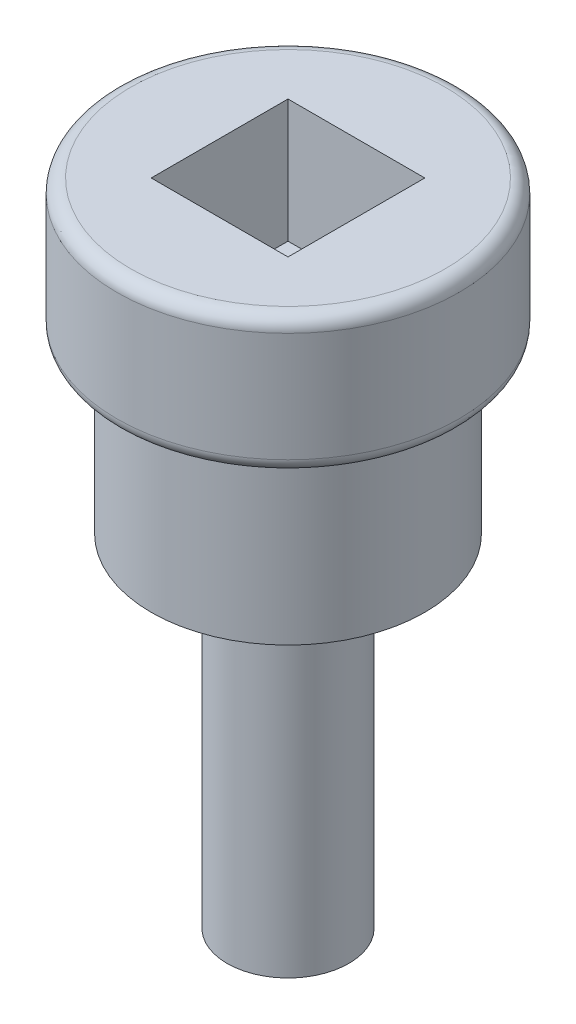
ISO-10303-21;
HEADER;
FILE_DESCRIPTION(('STEP AP214'),'2;1');
FILE_NAME('part.step','',(''),(''),'','','');
FILE_SCHEMA(('AUTOMOTIVE_DESIGN { 1 0 10303 214 1 1 1 1 }'));
ENDSEC;
DATA;
#1=APPLICATION_CONTEXT('core data for automotive mechanical design processes');
#2=APPLICATION_PROTOCOL_DEFINITION('international standard','automotive_design',2000,#1);
#3=PRODUCT_CONTEXT('',#1,'mechanical');
#4=PRODUCT('Part','Part','',(#3));
#5=PRODUCT_RELATED_PRODUCT_CATEGORY('part','',(#4));
#6=PRODUCT_DEFINITION_FORMATION('','',#4);
#7=PRODUCT_DEFINITION_CONTEXT('part definition',#1,'design');
#8=PRODUCT_DEFINITION('design','',#6,#7);
#9=PRODUCT_DEFINITION_SHAPE('','',#8);
#10=(LENGTH_UNIT() NAMED_UNIT(*) SI_UNIT(.MILLI.,.METRE.));
#11=(NAMED_UNIT(*) PLANE_ANGLE_UNIT() SI_UNIT($,.RADIAN.));
#12=(NAMED_UNIT(*) SI_UNIT($,.STERADIAN.) SOLID_ANGLE_UNIT());
#13=UNCERTAINTY_MEASURE_WITH_UNIT(LENGTH_MEASURE(1.E-05),#10,'distance_accuracy_value','');
#14=(GEOMETRIC_REPRESENTATION_CONTEXT(3) GLOBAL_UNCERTAINTY_ASSIGNED_CONTEXT((#13)) GLOBAL_UNIT_ASSIGNED_CONTEXT((#10,
#11,#12)) REPRESENTATION_CONTEXT('',''));
#15=CARTESIAN_POINT('',(0.,0.,0.));
#16=DIRECTION('',(0.,0.,1.));
#17=DIRECTION('',(1.,0.,0.));
#18=AXIS2_PLACEMENT_3D('',#15,#16,#17);
#19=CARTESIAN_POINT('',(0.,-5.715,0.));
#20=DIRECTION('',(0.,1.,0.));
#21=DIRECTION('',(0.,0.,1.));
#22=AXIS2_PLACEMENT_3D('',#19,#20,#21);
#23=CYLINDRICAL_SURFACE('',#22,2.54);
#24=CARTESIAN_POINT('',(0.,-5.715,0.));
#25=DIRECTION('',(0.,1.,0.));
#26=DIRECTION('',(0.,0.,1.));
#27=AXIS2_PLACEMENT_3D('',#24,#25,#26);
#28=CIRCLE('',#27,2.54);
#29=CARTESIAN_POINT('',(0.,-5.715,2.54));
#30=VERTEX_POINT('',#29);
#31=EDGE_CURVE('E120',#30,#30,#28,.T.);
#32=ORIENTED_EDGE('',*,*,#31,.T.);
#33=EDGE_LOOP('',(#32));
#34=FACE_BOUND('',#33,.T.);
#35=CARTESIAN_POINT('',(0.,-2.54,0.));
#36=DIRECTION('',(0.,1.,0.));
#37=DIRECTION('',(0.,0.,1.));
#38=AXIS2_PLACEMENT_3D('',#35,#36,#37);
#39=CIRCLE('',#38,2.54);
#40=CARTESIAN_POINT('',(0.,-2.54,2.54));
#41=VERTEX_POINT('',#40);
#42=EDGE_CURVE('E111',#41,#41,#39,.F.);
#43=ORIENTED_EDGE('',*,*,#42,.T.);
#44=EDGE_LOOP('',(#43));
#45=FACE_BOUND('',#44,.T.);
#46=ADVANCED_FACE('F35',(#34,#45),#23,.T.);
#47=CARTESIAN_POINT('',(0.,-5.715,0.));
#48=DIRECTION('',(0.,1.,0.));
#49=DIRECTION('',(0.,0.,1.));
#50=AXIS2_PLACEMENT_3D('',#47,#48,#49);
#51=PLANE('',#50);
#52=CARTESIAN_POINT('',(0.,-5.715,0.));
#53=DIRECTION('',(0.,1.,0.));
#54=DIRECTION('',(0.,0.,1.));
#55=AXIS2_PLACEMENT_3D('',#52,#53,#54);
#56=CIRCLE('',#55,1.1303);
#57=CARTESIAN_POINT('',(0.,-5.715,1.1303));
#58=VERTEX_POINT('',#57);
#59=EDGE_CURVE('E117',#58,#58,#56,.T.);
#60=ORIENTED_EDGE('',*,*,#59,.T.);
#61=EDGE_LOOP('',(#60));
#62=FACE_BOUND('',#61,.T.);
#63=ORIENTED_EDGE('',*,*,#31,.F.);
#64=EDGE_LOOP('',(#63));
#65=FACE_BOUND('',#64,.T.);
#66=ADVANCED_FACE('F169',(#62,#65),#51,.F.);
#67=CARTESIAN_POINT('',(0.,-12.065,0.));
#68=DIRECTION('',(0.,1.,0.));
#69=DIRECTION('',(0.,0.,1.));
#70=AXIS2_PLACEMENT_3D('',#67,#68,#69);
#71=CYLINDRICAL_SURFACE('',#70,1.1303);
#72=CARTESIAN_POINT('',(0.,-12.065,0.));
#73=DIRECTION('',(0.,1.,0.));
#74=DIRECTION('',(0.,0.,1.));
#75=AXIS2_PLACEMENT_3D('',#72,#73,#74);
#76=CIRCLE('',#75,1.1303);
#77=CARTESIAN_POINT('',(0.,-12.065,1.1303));
#78=VERTEX_POINT('',#77);
#79=EDGE_CURVE('E114',#78,#78,#76,.T.);
#80=CARTESIAN_POINT('',(0.,-12.065,1.1303));
#81=CARTESIAN_POINT('',(0.,-11.9988541666667,1.1303));
#82=CARTESIAN_POINT('',(0.,-11.9327083333333,1.1303));
#83=CARTESIAN_POINT('',(0.,-11.8004166666667,1.1303));
#84=CARTESIAN_POINT('',(0.,-11.7342708333333,1.1303));
#85=CARTESIAN_POINT('',(0.,-11.6019791666667,1.1303));
#86=CARTESIAN_POINT('',(0.,-11.5358333333333,1.1303));
#87=CARTESIAN_POINT('',(0.,-11.4035416666667,1.1303));
#88=CARTESIAN_POINT('',(0.,-11.3373958333333,1.1303));
#89=CARTESIAN_POINT('',(0.,-11.2051041666667,1.1303));
#90=CARTESIAN_POINT('',(0.,-11.1389583333333,1.1303));
#91=CARTESIAN_POINT('',(0.,-11.0066666666667,1.1303));
#92=CARTESIAN_POINT('',(0.,-10.9405208333333,1.1303));
#93=CARTESIAN_POINT('',(0.,-10.8082291666667,1.1303));
#94=CARTESIAN_POINT('',(0.,-10.7420833333333,1.1303));
#95=CARTESIAN_POINT('',(0.,-10.6097916666667,1.1303));
#96=CARTESIAN_POINT('',(0.,-10.5436458333333,1.1303));
#97=CARTESIAN_POINT('',(0.,-10.4113541666667,1.1303));
#98=CARTESIAN_POINT('',(0.,-10.3452083333333,1.1303));
#99=CARTESIAN_POINT('',(0.,-10.2129166666667,1.1303));
#100=CARTESIAN_POINT('',(0.,-10.1467708333333,1.1303));
#101=CARTESIAN_POINT('',(0.,-10.0144791666667,1.1303));
#102=CARTESIAN_POINT('',(0.,-9.94833333333333,1.1303));
#103=CARTESIAN_POINT('',(0.,-9.81604166666667,1.1303));
#104=CARTESIAN_POINT('',(0.,-9.74989583333334,1.1303));
#105=CARTESIAN_POINT('',(0.,-9.61760416666667,1.1303));
#106=CARTESIAN_POINT('',(0.,-9.55145833333333,1.1303));
#107=CARTESIAN_POINT('',(0.,-9.41916666666667,1.1303));
#108=CARTESIAN_POINT('',(0.,-9.35302083333333,1.1303));
#109=CARTESIAN_POINT('',(0.,-9.22072916666667,1.1303));
#110=CARTESIAN_POINT('',(0.,-9.15458333333333,1.1303));
#111=CARTESIAN_POINT('',(0.,-9.02229166666667,1.1303));
#112=CARTESIAN_POINT('',(0.,-8.95614583333333,1.1303));
#113=CARTESIAN_POINT('',(0.,-8.82385416666667,1.1303));
#114=CARTESIAN_POINT('',(0.,-8.75770833333333,1.1303));
#115=CARTESIAN_POINT('',(0.,-8.62541666666667,1.1303));
#116=CARTESIAN_POINT('',(0.,-8.55927083333333,1.1303));
#117=CARTESIAN_POINT('',(0.,-8.42697916666667,1.1303));
#118=CARTESIAN_POINT('',(0.,-8.36083333333333,1.1303));
#119=CARTESIAN_POINT('',(0.,-8.22854166666667,1.1303));
#120=CARTESIAN_POINT('',(0.,-8.16239583333333,1.1303));
#121=CARTESIAN_POINT('',(0.,-8.03010416666667,1.1303));
#122=CARTESIAN_POINT('',(0.,-7.96395833333333,1.1303));
#123=CARTESIAN_POINT('',(0.,-7.83166666666667,1.1303));
#124=CARTESIAN_POINT('',(0.,-7.76552083333333,1.1303));
#125=CARTESIAN_POINT('',(0.,-7.63322916666667,1.1303));
#126=CARTESIAN_POINT('',(0.,-7.56708333333333,1.1303));
#127=CARTESIAN_POINT('',(0.,-7.43479166666667,1.1303));
#128=CARTESIAN_POINT('',(0.,-7.36864583333333,1.1303));
#129=CARTESIAN_POINT('',(0.,-7.23635416666667,1.1303));
#130=CARTESIAN_POINT('',(0.,-7.17020833333333,1.1303));
#131=CARTESIAN_POINT('',(0.,-7.03791666666667,1.1303));
#132=CARTESIAN_POINT('',(0.,-6.97177083333333,1.1303));
#133=CARTESIAN_POINT('',(0.,-6.83947916666667,1.1303));
#134=CARTESIAN_POINT('',(0.,-6.77333333333333,1.1303));
#135=CARTESIAN_POINT('',(0.,-6.64104166666667,1.1303));
#136=CARTESIAN_POINT('',(0.,-6.57489583333333,1.1303));
#137=CARTESIAN_POINT('',(0.,-6.44260416666667,1.1303));
#138=CARTESIAN_POINT('',(0.,-6.37645833333333,1.1303));
#139=CARTESIAN_POINT('',(0.,-6.24416666666667,1.1303));
#140=CARTESIAN_POINT('',(0.,-6.17802083333333,1.1303));
#141=CARTESIAN_POINT('',(0.,-6.04572916666667,1.1303));
#142=CARTESIAN_POINT('',(0.,-5.97958333333333,1.1303));
#143=CARTESIAN_POINT('',(0.,-5.84729166666667,1.1303));
#144=CARTESIAN_POINT('',(0.,-5.78114583333333,1.1303));
#145=CARTESIAN_POINT('',(0.,-5.715,1.1303));
#146=B_SPLINE_CURVE_WITH_KNOTS('',3,(#80,#81,#82,#83,#84,#85,#86,#87,#88,#89,#90,#91,#92,#93,
#94,#95,#96,#97,#98,#99,#100,#101,#102,#103,#104,#105,#106,#107,#108,#109,#110,#111,#112,#113,
#114,#115,#116,#117,#118,#119,#120,#121,#122,#123,#124,#125,#126,#127,#128,#129,#130,#131,#132,
#133,#134,#135,#136,#137,#138,#139,#140,#141,#142,#143,#144,#145),.UNSPECIFIED.,.F.,.F.,(4,2,2,
2,2,2,2,2,2,2,2,2,2,2,2,2,2,2,2,2,2,2,2,2,2,2,2,2,2,2,2,2,4),(0.,0.198437500000001,
0.396875000000001,0.5953125,0.793750000000001,0.9921875,1.190625,1.3890625,1.5875,1.7859375,
1.984375,2.1828125,2.38125,2.5796875,2.778125,2.9765625,3.175,3.3734375,3.571875,3.7703125,
3.96875,4.1671875,4.365625,4.5640625,4.7625,4.9609375,5.159375,5.3578125,5.55625,5.7546875,
5.953125,6.1515625,6.35),.UNSPECIFIED.);
#147=EDGE_CURVE('BSEAM175',#78,#58,#146,.T.);
#148=ORIENTED_EDGE('',*,*,#79,.T.);
#149=ORIENTED_EDGE('',*,*,#59,.F.);
#150=ORIENTED_EDGE('',*,*,#147,.T.);
#151=ORIENTED_EDGE('',*,*,#147,.F.);
#152=EDGE_LOOP('',(#148,#150,#149,#151));
#153=FACE_BOUND('',#152,.T.);
#154=ADVANCED_FACE('F175',(#153),#71,.T.);
#155=CARTESIAN_POINT('',(0.,-12.065,0.));
#156=DIRECTION('',(0.,1.,0.));
#157=DIRECTION('',(0.,0.,1.));
#158=AXIS2_PLACEMENT_3D('',#155,#156,#157);
#159=PLANE('',#158);
#160=ORIENTED_EDGE('',*,*,#79,.F.);
#161=EDGE_LOOP('',(#160));
#162=FACE_BOUND('',#161,.T.);
#163=ADVANCED_FACE('F144',(#162),#159,.F.);
#164=CARTESIAN_POINT('',(0.,-2.54,0.));
#165=DIRECTION('',(0.,1.,0.));
#166=DIRECTION('',(0.,0.,1.));
#167=AXIS2_PLACEMENT_3D('',#164,#165,#166);
#168=CYLINDRICAL_SURFACE('',#167,3.175);
#169=CARTESIAN_POINT('',(0.,-2.286,0.));
#170=DIRECTION('',(0.,1.,0.));
#171=DIRECTION('',(0.,0.,1.));
#172=AXIS2_PLACEMENT_3D('',#169,#170,#171);
#173=CIRCLE('',#172,3.175);
#174=CARTESIAN_POINT('',(0.,-2.286,3.175));
#175=VERTEX_POINT('',#174);
#176=EDGE_CURVE('E128',#175,#175,#173,.T.);
#177=ORIENTED_EDGE('',*,*,#176,.T.);
#178=EDGE_LOOP('',(#177));
#179=FACE_BOUND('',#178,.T.);
#180=CARTESIAN_POINT('',(0.,-0.254,0.));
#181=DIRECTION('',(0.,1.,0.));
#182=DIRECTION('',(0.,0.,1.));
#183=AXIS2_PLACEMENT_3D('',#180,#181,#182);
#184=CIRCLE('',#183,3.175);
#185=CARTESIAN_POINT('',(0.,-0.254,3.175));
#186=VERTEX_POINT('',#185);
#187=EDGE_CURVE('E123',#186,#186,#184,.F.);
#188=ORIENTED_EDGE('',*,*,#187,.T.);
#189=EDGE_LOOP('',(#188));
#190=FACE_BOUND('',#189,.T.);
#191=ADVANCED_FACE('F141',(#179,#190),#168,.T.);
#192=CARTESIAN_POINT('',(0.,-2.54,0.));
#193=DIRECTION('',(0.,1.,0.));
#194=DIRECTION('',(0.,0.,1.));
#195=AXIS2_PLACEMENT_3D('',#192,#193,#194);
#196=PLANE('',#195);
#197=CARTESIAN_POINT('',(0.,-2.54,0.));
#198=DIRECTION('',(0.,1.,0.));
#199=DIRECTION('',(0.,0.,1.));
#200=AXIS2_PLACEMENT_3D('',#197,#198,#199);
#201=CIRCLE('',#200,2.921);
#202=CARTESIAN_POINT('',(0.,-2.54,2.921));
#203=VERTEX_POINT('',#202);
#204=EDGE_CURVE('E43',#203,#203,#201,.F.);
#205=ORIENTED_EDGE('',*,*,#204,.T.);
#206=EDGE_LOOP('',(#205));
#207=FACE_BOUND('',#206,.T.);
#208=ORIENTED_EDGE('',*,*,#42,.F.);
#209=EDGE_LOOP('',(#208));
#210=FACE_BOUND('',#209,.T.);
#211=ADVANCED_FACE('F133',(#207,#210),#196,.F.);
#212=CARTESIAN_POINT('',(0.,0.,0.));
#213=DIRECTION('',(0.,1.,0.));
#214=DIRECTION('',(0.,0.,1.));
#215=AXIS2_PLACEMENT_3D('',#212,#213,#214);
#216=PLANE('',#215);
#217=CARTESIAN_POINT('',(0.,0.,0.));
#218=DIRECTION('',(0.,1.,0.));
#219=DIRECTION('',(0.,0.,1.));
#220=AXIS2_PLACEMENT_3D('',#217,#218,#219);
#221=CIRCLE('',#220,2.921);
#222=CARTESIAN_POINT('',(0.,0.,2.921));
#223=VERTEX_POINT('',#222);
#224=EDGE_CURVE('E11',#223,#223,#221,.T.);
#225=ORIENTED_EDGE('',*,*,#224,.T.);
#226=EDGE_LOOP('',(#225));
#227=FACE_BOUND('',#226,.T.);
#228=DIRECTION('',(0.,0.,1.));
#229=VECTOR('',#228,1.);
#230=CARTESIAN_POINT('',(-1.27,0.,-1.27));
#231=LINE('',#230,#229);
#232=CARTESIAN_POINT('',(-1.27,0.,-1.27));
#233=VERTEX_POINT('',#232);
#234=CARTESIAN_POINT('',(-1.27,0.,1.27));
#235=VERTEX_POINT('',#234);
#236=EDGE_CURVE('E50',#233,#235,#231,.T.);
#237=ORIENTED_EDGE('',*,*,#236,.F.);
#238=DIRECTION('',(-1.,0.,0.));
#239=VECTOR('',#238,1.);
#240=CARTESIAN_POINT('',(-1.27,0.,-1.27));
#241=LINE('',#240,#239);
#242=CARTESIAN_POINT('',(1.27,0.,-1.27));
#243=VERTEX_POINT('',#242);
#244=EDGE_CURVE('E101',#243,#233,#241,.T.);
#245=ORIENTED_EDGE('',*,*,#244,.F.);
#246=DIRECTION('',(0.,0.,-1.));
#247=VECTOR('',#246,1.);
#248=CARTESIAN_POINT('',(1.27,0.,-1.27));
#249=LINE('',#248,#247);
#250=CARTESIAN_POINT('',(1.27,0.,1.27));
#251=VERTEX_POINT('',#250);
#252=EDGE_CURVE('E107',#251,#243,#249,.T.);
#253=ORIENTED_EDGE('',*,*,#252,.F.);
#254=DIRECTION('',(1.,0.,0.));
#255=VECTOR('',#254,1.);
#256=CARTESIAN_POINT('',(-1.27,0.,1.27));
#257=LINE('',#256,#255);
#258=EDGE_CURVE('E85',#235,#251,#257,.T.);
#259=ORIENTED_EDGE('',*,*,#258,.F.);
#260=EDGE_LOOP('',(#237,#245,#253,#259));
#261=FACE_BOUND('',#260,.T.);
#262=ADVANCED_FACE('F152',(#227,#261),#216,.T.);
#263=CARTESIAN_POINT('',(-1.27,-2.286,-1.27));
#264=DIRECTION('',(-1.,0.,0.));
#265=DIRECTION('',(0.,0.,1.));
#266=AXIS2_PLACEMENT_3D('',#263,#264,#265);
#267=PLANE('',#266);
#268=ORIENTED_EDGE('',*,*,#236,.T.);
#269=DIRECTION('',(0.,1.,0.));
#270=VECTOR('',#269,1.);
#271=CARTESIAN_POINT('',(-1.27,-2.286,1.27));
#272=LINE('',#271,#270);
#273=CARTESIAN_POINT('',(-1.27,-2.286,1.27));
#274=VERTEX_POINT('',#273);
#275=EDGE_CURVE('E73',#274,#235,#272,.T.);
#276=ORIENTED_EDGE('',*,*,#275,.F.);
#277=DIRECTION('',(0.,0.,1.));
#278=VECTOR('',#277,1.);
#279=CARTESIAN_POINT('',(-1.27,-2.286,-1.27));
#280=LINE('',#279,#278);
#281=CARTESIAN_POINT('',(-1.27,-2.286,-1.27));
#282=VERTEX_POINT('',#281);
#283=EDGE_CURVE('E99',#282,#274,#280,.T.);
#284=ORIENTED_EDGE('',*,*,#283,.F.);
#285=DIRECTION('',(0.,1.,0.));
#286=VECTOR('',#285,1.);
#287=CARTESIAN_POINT('',(-1.27,-2.286,-1.27));
#288=LINE('',#287,#286);
#289=EDGE_CURVE('E58',#282,#233,#288,.T.);
#290=ORIENTED_EDGE('',*,*,#289,.T.);
#291=EDGE_LOOP('',(#268,#276,#284,#290));
#292=FACE_BOUND('',#291,.T.);
#293=ADVANCED_FACE('F155',(#292),#267,.F.);
#294=CARTESIAN_POINT('',(-1.27,-2.286,-1.27));
#295=DIRECTION('',(0.,0.,-1.));
#296=DIRECTION('',(-1.,0.,0.));
#297=AXIS2_PLACEMENT_3D('',#294,#295,#296);
#298=PLANE('',#297);
#299=ORIENTED_EDGE('',*,*,#244,.T.);
#300=ORIENTED_EDGE('',*,*,#289,.F.);
#301=DIRECTION('',(-1.,0.,0.));
#302=VECTOR('',#301,1.);
#303=CARTESIAN_POINT('',(-1.27,-2.286,-1.27));
#304=LINE('',#303,#302);
#305=CARTESIAN_POINT('',(1.27,-2.286,-1.27));
#306=VERTEX_POINT('',#305);
#307=EDGE_CURVE('E96',#306,#282,#304,.T.);
#308=ORIENTED_EDGE('',*,*,#307,.F.);
#309=DIRECTION('',(0.,1.,0.));
#310=VECTOR('',#309,1.);
#311=CARTESIAN_POINT('',(1.27,-2.286,-1.27));
#312=LINE('',#311,#310);
#313=EDGE_CURVE('E89',#306,#243,#312,.T.);
#314=ORIENTED_EDGE('',*,*,#313,.T.);
#315=EDGE_LOOP('',(#299,#300,#308,#314));
#316=FACE_BOUND('',#315,.T.);
#317=ADVANCED_FACE('F158',(#316),#298,.F.);
#318=CARTESIAN_POINT('',(1.27,-2.286,-1.27));
#319=DIRECTION('',(1.,0.,0.));
#320=DIRECTION('',(0.,0.,-1.));
#321=AXIS2_PLACEMENT_3D('',#318,#319,#320);
#322=PLANE('',#321);
#323=ORIENTED_EDGE('',*,*,#252,.T.);
#324=ORIENTED_EDGE('',*,*,#313,.F.);
#325=DIRECTION('',(0.,0.,-1.));
#326=VECTOR('',#325,1.);
#327=CARTESIAN_POINT('',(1.27,-2.286,-1.27));
#328=LINE('',#327,#326);
#329=CARTESIAN_POINT('',(1.27,-2.286,1.27));
#330=VERTEX_POINT('',#329);
#331=EDGE_CURVE('E92',#330,#306,#328,.T.);
#332=ORIENTED_EDGE('',*,*,#331,.F.);
#333=DIRECTION('',(0.,1.,0.));
#334=VECTOR('',#333,1.);
#335=CARTESIAN_POINT('',(1.27,-2.286,1.27));
#336=LINE('',#335,#334);
#337=EDGE_CURVE('E78',#330,#251,#336,.T.);
#338=ORIENTED_EDGE('',*,*,#337,.T.);
#339=EDGE_LOOP('',(#323,#324,#332,#338));
#340=FACE_BOUND('',#339,.T.);
#341=ADVANCED_FACE('F93',(#340),#322,.F.);
#342=CARTESIAN_POINT('',(-1.27,-2.286,1.27));
#343=DIRECTION('',(0.,0.,1.));
#344=DIRECTION('',(1.,0.,0.));
#345=AXIS2_PLACEMENT_3D('',#342,#343,#344);
#346=PLANE('',#345);
#347=ORIENTED_EDGE('',*,*,#258,.T.);
#348=ORIENTED_EDGE('',*,*,#337,.F.);
#349=DIRECTION('',(1.,0.,0.));
#350=VECTOR('',#349,1.);
#351=CARTESIAN_POINT('',(-1.27,-2.286,1.27));
#352=LINE('',#351,#350);
#353=EDGE_CURVE('E82',#274,#330,#352,.T.);
#354=ORIENTED_EDGE('',*,*,#353,.F.);
#355=ORIENTED_EDGE('',*,*,#275,.T.);
#356=EDGE_LOOP('',(#347,#348,#354,#355));
#357=FACE_BOUND('',#356,.T.);
#358=ADVANCED_FACE('F80',(#357),#346,.F.);
#359=CARTESIAN_POINT('',(0.,-2.286,0.));
#360=DIRECTION('',(0.,1.,0.));
#361=DIRECTION('',(0.,0.,1.));
#362=AXIS2_PLACEMENT_3D('',#359,#360,#361);
#363=PLANE('',#362);
#364=ORIENTED_EDGE('',*,*,#283,.T.);
#365=ORIENTED_EDGE('',*,*,#353,.T.);
#366=ORIENTED_EDGE('',*,*,#331,.T.);
#367=ORIENTED_EDGE('',*,*,#307,.T.);
#368=EDGE_LOOP('',(#364,#365,#366,#367));
#369=FACE_BOUND('',#368,.T.);
#370=ADVANCED_FACE('F98',(#369),#363,.T.);
#371=CARTESIAN_POINT('',(0.,-2.286,0.));
#372=DIRECTION('',(0.,1.,0.));
#373=DIRECTION('',(0.,0.,1.));
#374=AXIS2_PLACEMENT_3D('',#371,#372,#373);
#375=TOROIDAL_SURFACE('',#374,2.921,0.254);
#376=ORIENTED_EDGE('',*,*,#204,.F.);
#377=EDGE_LOOP('',(#376));
#378=FACE_BOUND('',#377,.T.);
#379=ORIENTED_EDGE('',*,*,#176,.F.);
#380=EDGE_LOOP('',(#379));
#381=FACE_BOUND('',#380,.T.);
#382=ADVANCED_FACE('F136',(#378,#381),#375,.T.);
#383=CARTESIAN_POINT('',(0.,-0.254,0.));
#384=DIRECTION('',(0.,1.,0.));
#385=DIRECTION('',(0.,0.,1.));
#386=AXIS2_PLACEMENT_3D('',#383,#384,#385);
#387=TOROIDAL_SURFACE('',#386,2.921,0.254);
#388=ORIENTED_EDGE('',*,*,#187,.F.);
#389=EDGE_LOOP('',(#388));
#390=FACE_BOUND('',#389,.T.);
#391=ORIENTED_EDGE('',*,*,#224,.F.);
#392=EDGE_LOOP('',(#391));
#393=FACE_BOUND('',#392,.T.);
#394=ADVANCED_FACE('F37',(#390,#393),#387,.T.);
#395=CLOSED_SHELL('',(#46,#66,#154,#163,#191,#211,#262,#293,#317,#341,#358,#370,#382,#394));
#396=MANIFOLD_SOLID_BREP('B2',#395);
#397=ADVANCED_BREP_SHAPE_REPRESENTATION('',(#18,#396),#14);
#398=SHAPE_DEFINITION_REPRESENTATION(#9,#397);
ENDSEC;
END-ISO-10303-21;
